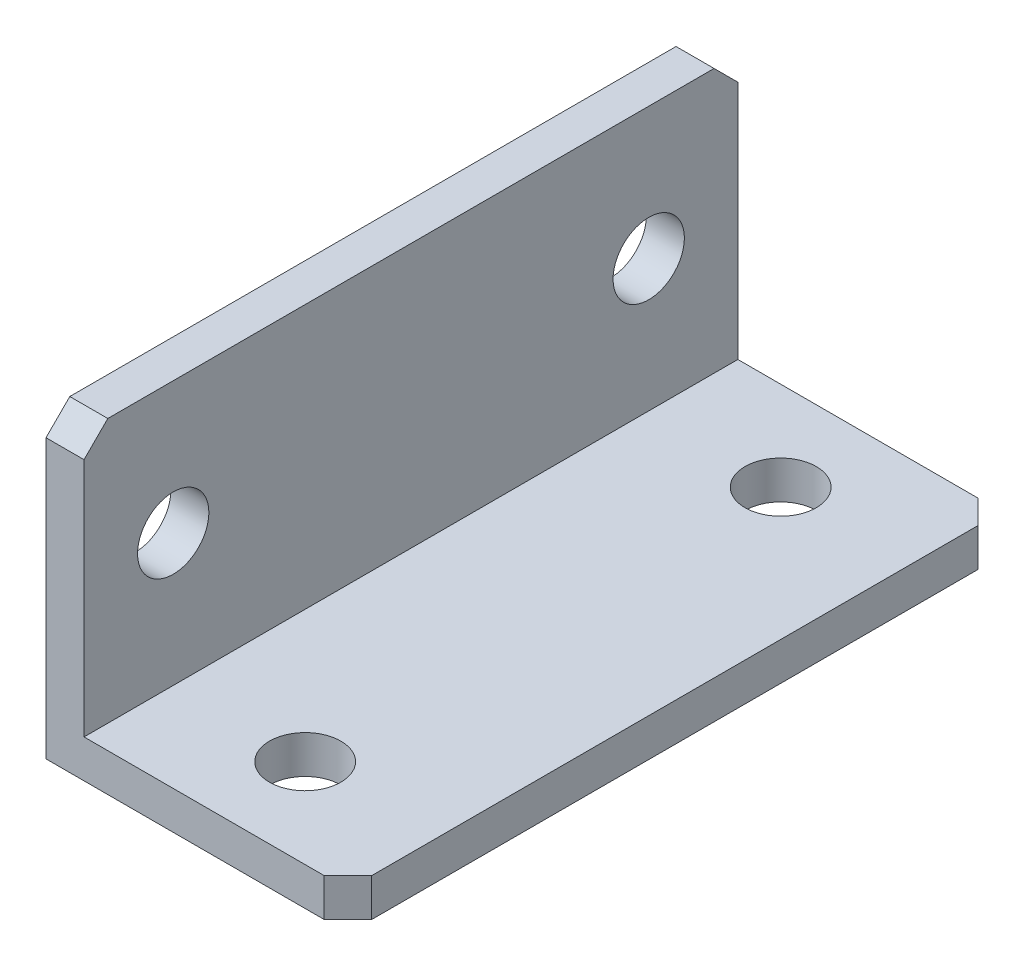
ISO-10303-21;
HEADER;
FILE_DESCRIPTION(('STEP AP214'),'2;1');
FILE_NAME('part.step','',(''),(''),'','','');
FILE_SCHEMA(('AUTOMOTIVE_DESIGN { 1 0 10303 214 1 1 1 1 }'));
ENDSEC;
DATA;
#1=APPLICATION_CONTEXT('core data for automotive mechanical design processes');
#2=APPLICATION_PROTOCOL_DEFINITION('international standard','automotive_design',2000,#1);
#3=PRODUCT_CONTEXT('',#1,'mechanical');
#4=PRODUCT('Part','Part','',(#3));
#5=PRODUCT_RELATED_PRODUCT_CATEGORY('part','',(#4));
#6=PRODUCT_DEFINITION_FORMATION('','',#4);
#7=PRODUCT_DEFINITION_CONTEXT('part definition',#1,'design');
#8=PRODUCT_DEFINITION('design','',#6,#7);
#9=PRODUCT_DEFINITION_SHAPE('','',#8);
#10=(LENGTH_UNIT() NAMED_UNIT(*) SI_UNIT(.MILLI.,.METRE.));
#11=(NAMED_UNIT(*) PLANE_ANGLE_UNIT() SI_UNIT($,.RADIAN.));
#12=(NAMED_UNIT(*) SI_UNIT($,.STERADIAN.) SOLID_ANGLE_UNIT());
#13=UNCERTAINTY_MEASURE_WITH_UNIT(LENGTH_MEASURE(1.E-05),#10,'distance_accuracy_value','');
#14=(GEOMETRIC_REPRESENTATION_CONTEXT(3) GLOBAL_UNCERTAINTY_ASSIGNED_CONTEXT((#13)) GLOBAL_UNIT_ASSIGNED_CONTEXT((#10,
#11,#12)) REPRESENTATION_CONTEXT('',''));
#15=CARTESIAN_POINT('',(0.,0.,0.));
#16=DIRECTION('',(0.,0.,1.));
#17=DIRECTION('',(1.,0.,0.));
#18=AXIS2_PLACEMENT_3D('',#15,#16,#17);
#19=CARTESIAN_POINT('',(22.2,0.,55.));
#20=DIRECTION('',(0.,-1.,0.));
#21=DIRECTION('',(1.,0.,0.));
#22=AXIS2_PLACEMENT_3D('',#19,#20,#21);
#23=PLANE('',#22);
#24=CARTESIAN_POINT('',(11.1,0.,7.5));
#25=DIRECTION('',(0.,1.,0.));
#26=DIRECTION('',(-1.,0.,0.));
#27=AXIS2_PLACEMENT_3D('',#24,#25,#26);
#28=CIRCLE('',#27,3.);
#29=CARTESIAN_POINT('',(8.1,0.,7.5));
#30=VERTEX_POINT('',#29);
#31=EDGE_CURVE('E333',#30,#30,#28,.T.);
#32=ORIENTED_EDGE('',*,*,#31,.F.);
#33=EDGE_LOOP('',(#32));
#34=FACE_BOUND('',#33,.T.);
#35=CARTESIAN_POINT('',(11.1,0.,47.5));
#36=DIRECTION('',(0.,1.,0.));
#37=DIRECTION('',(-1.,0.,0.));
#38=AXIS2_PLACEMENT_3D('',#35,#36,#37);
#39=CIRCLE('',#38,3.);
#40=CARTESIAN_POINT('',(8.1,0.,47.5));
#41=VERTEX_POINT('',#40);
#42=EDGE_CURVE('E337',#41,#41,#39,.T.);
#43=ORIENTED_EDGE('',*,*,#42,.F.);
#44=EDGE_LOOP('',(#43));
#45=FACE_BOUND('',#44,.T.);
#46=DIRECTION('',(0.,0.,-1.));
#47=VECTOR('',#46,1.);
#48=CARTESIAN_POINT('',(22.2,0.,55.));
#49=LINE('',#48,#47);
#50=CARTESIAN_POINT('',(22.2,0.,53.));
#51=VERTEX_POINT('',#50);
#52=CARTESIAN_POINT('',(22.2,0.,2.00000000000002));
#53=VERTEX_POINT('',#52);
#54=EDGE_CURVE('E214',#51,#53,#49,.T.);
#55=ORIENTED_EDGE('',*,*,#54,.T.);
#56=DIRECTION('',(-0.707106781186548,0.,-0.707106781186548));
#57=VECTOR('',#56,1.);
#58=CARTESIAN_POINT('',(22.2,0.,2.00000000000002));
#59=LINE('',#58,#57);
#60=CARTESIAN_POINT('',(20.2,0.,0.));
#61=VERTEX_POINT('',#60);
#62=EDGE_CURVE('E201',#53,#61,#59,.T.);
#63=ORIENTED_EDGE('',*,*,#62,.T.);
#64=DIRECTION('',(-1.,0.,0.));
#65=VECTOR('',#64,1.);
#66=CARTESIAN_POINT('',(22.2,0.,0.));
#67=LINE('',#66,#65);
#68=CARTESIAN_POINT('',(0.,0.,0.));
#69=VERTEX_POINT('',#68);
#70=EDGE_CURVE('E152',#61,#69,#67,.T.);
#71=ORIENTED_EDGE('',*,*,#70,.T.);
#72=DIRECTION('',(0.,0.,-1.));
#73=VECTOR('',#72,1.);
#74=CARTESIAN_POINT('',(0.,0.,55.));
#75=LINE('',#74,#73);
#76=CARTESIAN_POINT('',(0.,0.,55.));
#77=VERTEX_POINT('',#76);
#78=EDGE_CURVE('E143',#77,#69,#75,.T.);
#79=ORIENTED_EDGE('',*,*,#78,.F.);
#80=DIRECTION('',(-1.,0.,0.));
#81=VECTOR('',#80,1.);
#82=CARTESIAN_POINT('',(22.2,0.,55.));
#83=LINE('',#82,#81);
#84=CARTESIAN_POINT('',(20.2,0.,55.));
#85=VERTEX_POINT('',#84);
#86=EDGE_CURVE('E125',#85,#77,#83,.T.);
#87=ORIENTED_EDGE('',*,*,#86,.F.);
#88=DIRECTION('',(-0.707106781186548,0.,0.707106781186548));
#89=VECTOR('',#88,1.);
#90=CARTESIAN_POINT('',(20.2,0.,55.));
#91=LINE('',#90,#89);
#92=EDGE_CURVE('E198',#85,#51,#91,.F.);
#93=ORIENTED_EDGE('',*,*,#92,.T.);
#94=EDGE_LOOP('',(#55,#63,#71,#79,#87,#93));
#95=FACE_BOUND('',#94,.T.);
#96=ADVANCED_FACE('F45',(#34,#45,#95),#23,.F.);
#97=CARTESIAN_POINT('',(0.,0.,55.));
#98=DIRECTION('',(-1.,0.,0.));
#99=DIRECTION('',(0.,-1.,0.));
#100=AXIS2_PLACEMENT_3D('',#97,#98,#99);
#101=PLANE('',#100);
#102=CARTESIAN_POINT('',(0.,11.1,47.5));
#103=DIRECTION('',(1.,0.,0.));
#104=DIRECTION('',(0.,1.,0.));
#105=AXIS2_PLACEMENT_3D('',#102,#103,#104);
#106=CIRCLE('',#105,3.);
#107=CARTESIAN_POINT('',(0.,14.1,47.5));
#108=VERTEX_POINT('',#107);
#109=EDGE_CURVE('E315',#108,#108,#106,.T.);
#110=ORIENTED_EDGE('',*,*,#109,.F.);
#111=EDGE_LOOP('',(#110));
#112=FACE_BOUND('',#111,.T.);
#113=CARTESIAN_POINT('',(0.,11.1,7.5));
#114=DIRECTION('',(1.,0.,0.));
#115=DIRECTION('',(0.,1.,0.));
#116=AXIS2_PLACEMENT_3D('',#113,#114,#115);
#117=CIRCLE('',#116,3.);
#118=CARTESIAN_POINT('',(0.,14.1,7.5));
#119=VERTEX_POINT('',#118);
#120=EDGE_CURVE('E317',#119,#119,#117,.T.);
#121=ORIENTED_EDGE('',*,*,#120,.F.);
#122=EDGE_LOOP('',(#121));
#123=FACE_BOUND('',#122,.T.);
#124=DIRECTION('',(0.,1.,0.));
#125=VECTOR('',#124,1.);
#126=CARTESIAN_POINT('',(0.,0.,0.));
#127=LINE('',#126,#125);
#128=CARTESIAN_POINT('',(0.,20.2,0.));
#129=VERTEX_POINT('',#128);
#130=EDGE_CURVE('E244',#69,#129,#127,.T.);
#131=ORIENTED_EDGE('',*,*,#130,.T.);
#132=DIRECTION('',(0.,0.707106781186548,0.707106781186548));
#133=VECTOR('',#132,1.);
#134=CARTESIAN_POINT('',(0.,22.2,2.00000000000002));
#135=LINE('',#134,#133);
#136=CARTESIAN_POINT('',(0.,22.2,2.00000000000002));
#137=VERTEX_POINT('',#136);
#138=EDGE_CURVE('E184',#129,#137,#135,.T.);
#139=ORIENTED_EDGE('',*,*,#138,.T.);
#140=DIRECTION('',(0.,0.,-1.));
#141=VECTOR('',#140,1.);
#142=CARTESIAN_POINT('',(0.,22.2,55.));
#143=LINE('',#142,#141);
#144=CARTESIAN_POINT('',(0.,22.2,53.));
#145=VERTEX_POINT('',#144);
#146=EDGE_CURVE('E156',#145,#137,#143,.T.);
#147=ORIENTED_EDGE('',*,*,#146,.F.);
#148=DIRECTION('',(0.,0.707106781186548,-0.707106781186548));
#149=VECTOR('',#148,1.);
#150=CARTESIAN_POINT('',(0.,20.2,55.));
#151=LINE('',#150,#149);
#152=CARTESIAN_POINT('',(0.,20.2,55.));
#153=VERTEX_POINT('',#152);
#154=EDGE_CURVE('E146',#145,#153,#151,.F.);
#155=ORIENTED_EDGE('',*,*,#154,.T.);
#156=DIRECTION('',(0.,1.,0.));
#157=VECTOR('',#156,1.);
#158=CARTESIAN_POINT('',(0.,0.,55.));
#159=LINE('',#158,#157);
#160=EDGE_CURVE('E129',#77,#153,#159,.T.);
#161=ORIENTED_EDGE('',*,*,#160,.F.);
#162=ORIENTED_EDGE('',*,*,#78,.T.);
#163=EDGE_LOOP('',(#131,#139,#147,#155,#161,#162));
#164=FACE_BOUND('',#163,.T.);
#165=ADVANCED_FACE('F142',(#112,#123,#164),#101,.F.);
#166=CARTESIAN_POINT('',(0.,22.2,55.));
#167=DIRECTION('',(0.,-1.,0.));
#168=DIRECTION('',(0.,0.,-1.));
#169=AXIS2_PLACEMENT_3D('',#166,#167,#168);
#170=PLANE('',#169);
#171=ORIENTED_EDGE('',*,*,#146,.T.);
#172=DIRECTION('',(-1.,0.,0.));
#173=VECTOR('',#172,1.);
#174=CARTESIAN_POINT('',(-3.2,22.2,2.00000000000002));
#175=LINE('',#174,#173);
#176=CARTESIAN_POINT('',(-3.2,22.2,2.00000000000002));
#177=VERTEX_POINT('',#176);
#178=EDGE_CURVE('E160',#137,#177,#175,.T.);
#179=ORIENTED_EDGE('',*,*,#178,.T.);
#180=DIRECTION('',(0.,0.,-1.));
#181=VECTOR('',#180,1.);
#182=CARTESIAN_POINT('',(-3.2,22.2,55.));
#183=LINE('',#182,#181);
#184=CARTESIAN_POINT('',(-3.2,22.2,53.));
#185=VERTEX_POINT('',#184);
#186=EDGE_CURVE('E163',#185,#177,#183,.T.);
#187=ORIENTED_EDGE('',*,*,#186,.F.);
#188=DIRECTION('',(1.,0.,0.));
#189=VECTOR('',#188,1.);
#190=CARTESIAN_POINT('',(0.,22.2,53.));
#191=LINE('',#190,#189);
#192=EDGE_CURVE('E155',#185,#145,#191,.T.);
#193=ORIENTED_EDGE('',*,*,#192,.T.);
#194=EDGE_LOOP('',(#171,#179,#187,#193));
#195=FACE_BOUND('',#194,.T.);
#196=ADVANCED_FACE('F235',(#195),#170,.F.);
#197=CARTESIAN_POINT('',(-3.2,22.2,55.));
#198=DIRECTION('',(1.,0.,0.));
#199=DIRECTION('',(0.,1.,0.));
#200=AXIS2_PLACEMENT_3D('',#197,#198,#199);
#201=PLANE('',#200);
#202=CARTESIAN_POINT('',(-3.2,11.1,47.5));
#203=DIRECTION('',(1.,0.,0.));
#204=DIRECTION('',(0.,1.,0.));
#205=AXIS2_PLACEMENT_3D('',#202,#203,#204);
#206=CIRCLE('',#205,3.);
#207=CARTESIAN_POINT('',(-3.2,14.1,47.5));
#208=VERTEX_POINT('',#207);
#209=EDGE_CURVE('E312',#208,#208,#206,.T.);
#210=ORIENTED_EDGE('',*,*,#209,.T.);
#211=EDGE_LOOP('',(#210));
#212=FACE_BOUND('',#211,.T.);
#213=CARTESIAN_POINT('',(-3.2,11.1,7.5));
#214=DIRECTION('',(1.,0.,0.));
#215=DIRECTION('',(0.,1.,0.));
#216=AXIS2_PLACEMENT_3D('',#213,#214,#215);
#217=CIRCLE('',#216,3.);
#218=CARTESIAN_POINT('',(-3.2,14.1,7.5));
#219=VERTEX_POINT('',#218);
#220=EDGE_CURVE('E324',#219,#219,#217,.T.);
#221=ORIENTED_EDGE('',*,*,#220,.T.);
#222=EDGE_LOOP('',(#221));
#223=FACE_BOUND('',#222,.T.);
#224=ORIENTED_EDGE('',*,*,#186,.T.);
#225=DIRECTION('',(0.,-0.707106781186548,-0.707106781186548));
#226=VECTOR('',#225,1.);
#227=CARTESIAN_POINT('',(-3.2,22.2,2.00000000000002));
#228=LINE('',#227,#226);
#229=CARTESIAN_POINT('',(-3.2,20.2,0.));
#230=VERTEX_POINT('',#229);
#231=EDGE_CURVE('E173',#177,#230,#228,.T.);
#232=ORIENTED_EDGE('',*,*,#231,.T.);
#233=DIRECTION('',(0.,-1.,0.));
#234=VECTOR('',#233,1.);
#235=CARTESIAN_POINT('',(-3.2,22.2,0.));
#236=LINE('',#235,#234);
#237=CARTESIAN_POINT('',(-3.2,-3.2,0.));
#238=VERTEX_POINT('',#237);
#239=EDGE_CURVE('E247',#230,#238,#236,.T.);
#240=ORIENTED_EDGE('',*,*,#239,.T.);
#241=DIRECTION('',(0.,0.,-1.));
#242=VECTOR('',#241,1.);
#243=CARTESIAN_POINT('',(-3.2,-3.2,55.));
#244=LINE('',#243,#242);
#245=CARTESIAN_POINT('',(-3.2,-3.2,55.));
#246=VERTEX_POINT('',#245);
#247=EDGE_CURVE('E221',#246,#238,#244,.T.);
#248=ORIENTED_EDGE('',*,*,#247,.F.);
#249=DIRECTION('',(0.,-1.,0.));
#250=VECTOR('',#249,1.);
#251=CARTESIAN_POINT('',(-3.2,22.2,55.));
#252=LINE('',#251,#250);
#253=CARTESIAN_POINT('',(-3.2,20.2,55.));
#254=VERTEX_POINT('',#253);
#255=EDGE_CURVE('E148',#254,#246,#252,.T.);
#256=ORIENTED_EDGE('',*,*,#255,.F.);
#257=DIRECTION('',(0.,-0.707106781186548,0.707106781186548));
#258=VECTOR('',#257,1.);
#259=CARTESIAN_POINT('',(-3.2,20.2,55.));
#260=LINE('',#259,#258);
#261=EDGE_CURVE('E170',#254,#185,#260,.F.);
#262=ORIENTED_EDGE('',*,*,#261,.T.);
#263=EDGE_LOOP('',(#224,#232,#240,#248,#256,#262));
#264=FACE_BOUND('',#263,.T.);
#265=ADVANCED_FACE('F231',(#212,#223,#264),#201,.F.);
#266=CARTESIAN_POINT('',(-3.2,-3.2,55.));
#267=DIRECTION('',(0.,1.,0.));
#268=DIRECTION('',(-1.,0.,0.));
#269=AXIS2_PLACEMENT_3D('',#266,#267,#268);
#270=PLANE('',#269);
#271=CARTESIAN_POINT('',(11.1,-3.2,7.5));
#272=DIRECTION('',(0.,1.,0.));
#273=DIRECTION('',(-1.,0.,0.));
#274=AXIS2_PLACEMENT_3D('',#271,#272,#273);
#275=CIRCLE('',#274,3.);
#276=CARTESIAN_POINT('',(8.1,-3.2,7.5));
#277=VERTEX_POINT('',#276);
#278=EDGE_CURVE('E245',#277,#277,#275,.T.);
#279=ORIENTED_EDGE('',*,*,#278,.T.);
#280=EDGE_LOOP('',(#279));
#281=FACE_BOUND('',#280,.T.);
#282=CARTESIAN_POINT('',(11.1,-3.2,47.5));
#283=DIRECTION('',(0.,1.,0.));
#284=DIRECTION('',(-1.,0.,0.));
#285=AXIS2_PLACEMENT_3D('',#282,#283,#284);
#286=CIRCLE('',#285,3.);
#287=CARTESIAN_POINT('',(8.1,-3.2,47.5));
#288=VERTEX_POINT('',#287);
#289=EDGE_CURVE('E321',#288,#288,#286,.T.);
#290=ORIENTED_EDGE('',*,*,#289,.T.);
#291=EDGE_LOOP('',(#290));
#292=FACE_BOUND('',#291,.T.);
#293=DIRECTION('',(1.,0.,0.));
#294=VECTOR('',#293,1.);
#295=CARTESIAN_POINT('',(-3.2,-3.2,0.));
#296=LINE('',#295,#294);
#297=CARTESIAN_POINT('',(20.2,-3.2,0.));
#298=VERTEX_POINT('',#297);
#299=EDGE_CURVE('E137',#238,#298,#296,.T.);
#300=ORIENTED_EDGE('',*,*,#299,.T.);
#301=DIRECTION('',(0.707106781186548,0.,0.707106781186548));
#302=VECTOR('',#301,1.);
#303=CARTESIAN_POINT('',(22.2,-3.2,2.00000000000002));
#304=LINE('',#303,#302);
#305=CARTESIAN_POINT('',(22.2,-3.2,2.00000000000002));
#306=VERTEX_POINT('',#305);
#307=EDGE_CURVE('E11',#298,#306,#304,.T.);
#308=ORIENTED_EDGE('',*,*,#307,.T.);
#309=DIRECTION('',(0.,0.,-1.));
#310=VECTOR('',#309,1.);
#311=CARTESIAN_POINT('',(22.2,-3.2,55.));
#312=LINE('',#311,#310);
#313=CARTESIAN_POINT('',(22.2,-3.2,53.));
#314=VERTEX_POINT('',#313);
#315=EDGE_CURVE('E209',#314,#306,#312,.T.);
#316=ORIENTED_EDGE('',*,*,#315,.F.);
#317=DIRECTION('',(0.707106781186548,0.,-0.707106781186548));
#318=VECTOR('',#317,1.);
#319=CARTESIAN_POINT('',(20.2,-3.2,55.));
#320=LINE('',#319,#318);
#321=CARTESIAN_POINT('',(20.2,-3.2,55.));
#322=VERTEX_POINT('',#321);
#323=EDGE_CURVE('E55',#314,#322,#320,.F.);
#324=ORIENTED_EDGE('',*,*,#323,.T.);
#325=DIRECTION('',(1.,0.,0.));
#326=VECTOR('',#325,1.);
#327=CARTESIAN_POINT('',(-3.2,-3.2,55.));
#328=LINE('',#327,#326);
#329=EDGE_CURVE('E208',#246,#322,#328,.T.);
#330=ORIENTED_EDGE('',*,*,#329,.F.);
#331=ORIENTED_EDGE('',*,*,#247,.T.);
#332=EDGE_LOOP('',(#300,#308,#316,#324,#330,#331));
#333=FACE_BOUND('',#332,.T.);
#334=ADVANCED_FACE('F206',(#281,#292,#333),#270,.F.);
#335=CARTESIAN_POINT('',(22.2,-3.2,55.));
#336=DIRECTION('',(-1.,0.,0.));
#337=DIRECTION('',(0.,0.,1.));
#338=AXIS2_PLACEMENT_3D('',#335,#336,#337);
#339=PLANE('',#338);
#340=ORIENTED_EDGE('',*,*,#315,.T.);
#341=DIRECTION('',(0.,1.,0.));
#342=VECTOR('',#341,1.);
#343=CARTESIAN_POINT('',(22.2,0.,2.00000000000002));
#344=LINE('',#343,#342);
#345=EDGE_CURVE('E194',#306,#53,#344,.T.);
#346=ORIENTED_EDGE('',*,*,#345,.T.);
#347=ORIENTED_EDGE('',*,*,#54,.F.);
#348=DIRECTION('',(0.,-1.,0.));
#349=VECTOR('',#348,1.);
#350=CARTESIAN_POINT('',(22.2,-3.2,53.));
#351=LINE('',#350,#349);
#352=EDGE_CURVE('E67',#51,#314,#351,.T.);
#353=ORIENTED_EDGE('',*,*,#352,.T.);
#354=EDGE_LOOP('',(#340,#346,#347,#353));
#355=FACE_BOUND('',#354,.T.);
#356=ADVANCED_FACE('F216',(#355),#339,.F.);
#357=CARTESIAN_POINT('',(0.,0.,55.));
#358=DIRECTION('',(0.,0.,-1.));
#359=DIRECTION('',(-1.,0.,0.));
#360=AXIS2_PLACEMENT_3D('',#357,#358,#359);
#361=PLANE('',#360);
#362=ORIENTED_EDGE('',*,*,#160,.T.);
#363=DIRECTION('',(-1.,0.,0.));
#364=VECTOR('',#363,1.);
#365=CARTESIAN_POINT('',(0.,20.2,55.));
#366=LINE('',#365,#364);
#367=EDGE_CURVE('E189',#153,#254,#366,.T.);
#368=ORIENTED_EDGE('',*,*,#367,.T.);
#369=ORIENTED_EDGE('',*,*,#255,.T.);
#370=ORIENTED_EDGE('',*,*,#329,.T.);
#371=DIRECTION('',(0.,1.,0.));
#372=VECTOR('',#371,1.);
#373=CARTESIAN_POINT('',(20.2,0.,55.));
#374=LINE('',#373,#372);
#375=EDGE_CURVE('E133',#322,#85,#374,.T.);
#376=ORIENTED_EDGE('',*,*,#375,.T.);
#377=ORIENTED_EDGE('',*,*,#86,.T.);
#378=EDGE_LOOP('',(#362,#368,#369,#370,#376,#377));
#379=FACE_BOUND('',#378,.T.);
#380=ADVANCED_FACE('F127',(#379),#361,.F.);
#381=CARTESIAN_POINT('',(0.,0.,0.));
#382=DIRECTION('',(0.,0.,-1.));
#383=DIRECTION('',(-1.,0.,0.));
#384=AXIS2_PLACEMENT_3D('',#381,#382,#383);
#385=PLANE('',#384);
#386=ORIENTED_EDGE('',*,*,#239,.F.);
#387=DIRECTION('',(1.,0.,0.));
#388=VECTOR('',#387,1.);
#389=CARTESIAN_POINT('',(0.,20.2,0.));
#390=LINE('',#389,#388);
#391=EDGE_CURVE('E179',#230,#129,#390,.T.);
#392=ORIENTED_EDGE('',*,*,#391,.T.);
#393=ORIENTED_EDGE('',*,*,#130,.F.);
#394=ORIENTED_EDGE('',*,*,#70,.F.);
#395=DIRECTION('',(0.,-1.,0.));
#396=VECTOR('',#395,1.);
#397=CARTESIAN_POINT('',(20.2,-3.2,0.));
#398=LINE('',#397,#396);
#399=EDGE_CURVE('E176',#61,#298,#398,.T.);
#400=ORIENTED_EDGE('',*,*,#399,.T.);
#401=ORIENTED_EDGE('',*,*,#299,.F.);
#402=EDGE_LOOP('',(#386,#392,#393,#394,#400,#401));
#403=FACE_BOUND('',#402,.T.);
#404=ADVANCED_FACE('F255',(#403),#385,.T.);
#405=CARTESIAN_POINT('',(0.,22.2,2.00000000000002));
#406=DIRECTION('',(0.,0.707106781186547,-0.707106781186547));
#407=DIRECTION('',(1.,0.,0.));
#408=AXIS2_PLACEMENT_3D('',#405,#406,#407);
#409=PLANE('',#408);
#410=ORIENTED_EDGE('',*,*,#138,.F.);
#411=ORIENTED_EDGE('',*,*,#391,.F.);
#412=ORIENTED_EDGE('',*,*,#231,.F.);
#413=ORIENTED_EDGE('',*,*,#178,.F.);
#414=EDGE_LOOP('',(#410,#411,#412,#413));
#415=FACE_BOUND('',#414,.T.);
#416=ADVANCED_FACE('F259',(#415),#409,.T.);
#417=CARTESIAN_POINT('',(0.,20.2,55.));
#418=DIRECTION('',(0.,-0.707106781186547,-0.707106781186547));
#419=DIRECTION('',(-1.,0.,0.));
#420=AXIS2_PLACEMENT_3D('',#417,#418,#419);
#421=PLANE('',#420);
#422=ORIENTED_EDGE('',*,*,#154,.F.);
#423=ORIENTED_EDGE('',*,*,#192,.F.);
#424=ORIENTED_EDGE('',*,*,#261,.F.);
#425=ORIENTED_EDGE('',*,*,#367,.F.);
#426=EDGE_LOOP('',(#422,#423,#424,#425));
#427=FACE_BOUND('',#426,.T.);
#428=ADVANCED_FACE('F238',(#427),#421,.F.);
#429=CARTESIAN_POINT('',(22.2,-3.2,2.00000000000002));
#430=DIRECTION('',(0.707106781186547,0.,-0.707106781186547));
#431=DIRECTION('',(0.,-1.,0.));
#432=AXIS2_PLACEMENT_3D('',#429,#430,#431);
#433=PLANE('',#432);
#434=ORIENTED_EDGE('',*,*,#307,.F.);
#435=ORIENTED_EDGE('',*,*,#399,.F.);
#436=ORIENTED_EDGE('',*,*,#62,.F.);
#437=ORIENTED_EDGE('',*,*,#345,.F.);
#438=EDGE_LOOP('',(#434,#435,#436,#437));
#439=FACE_BOUND('',#438,.T.);
#440=ADVANCED_FACE('F254',(#439),#433,.T.);
#441=CARTESIAN_POINT('',(20.2,0.,55.));
#442=DIRECTION('',(-0.707106781186547,0.,-0.707106781186547));
#443=DIRECTION('',(0.,1.,0.));
#444=AXIS2_PLACEMENT_3D('',#441,#442,#443);
#445=PLANE('',#444);
#446=ORIENTED_EDGE('',*,*,#323,.F.);
#447=ORIENTED_EDGE('',*,*,#352,.F.);
#448=ORIENTED_EDGE('',*,*,#92,.F.);
#449=ORIENTED_EDGE('',*,*,#375,.F.);
#450=EDGE_LOOP('',(#446,#447,#448,#449));
#451=FACE_BOUND('',#450,.T.);
#452=ADVANCED_FACE('F48',(#451),#445,.F.);
#453=CARTESIAN_POINT('',(11.1,-3.2,47.5));
#454=DIRECTION('',(0.,1.,0.));
#455=DIRECTION('',(-1.,0.,0.));
#456=AXIS2_PLACEMENT_3D('',#453,#454,#455);
#457=CYLINDRICAL_SURFACE('',#456,3.);
#458=ORIENTED_EDGE('',*,*,#289,.F.);
#459=EDGE_LOOP('',(#458));
#460=FACE_BOUND('',#459,.T.);
#461=ORIENTED_EDGE('',*,*,#42,.T.);
#462=EDGE_LOOP('',(#461));
#463=FACE_BOUND('',#462,.T.);
#464=ADVANCED_FACE('F292',(#460,#463),#457,.F.);
#465=CARTESIAN_POINT('',(11.1,-3.2,7.5));
#466=DIRECTION('',(0.,1.,0.));
#467=DIRECTION('',(-1.,0.,0.));
#468=AXIS2_PLACEMENT_3D('',#465,#466,#467);
#469=CYLINDRICAL_SURFACE('',#468,3.);
#470=ORIENTED_EDGE('',*,*,#278,.F.);
#471=EDGE_LOOP('',(#470));
#472=FACE_BOUND('',#471,.T.);
#473=ORIENTED_EDGE('',*,*,#31,.T.);
#474=EDGE_LOOP('',(#473));
#475=FACE_BOUND('',#474,.T.);
#476=ADVANCED_FACE('F295',(#472,#475),#469,.F.);
#477=CARTESIAN_POINT('',(-3.2,11.1,7.5));
#478=DIRECTION('',(1.,0.,0.));
#479=DIRECTION('',(0.,1.,0.));
#480=AXIS2_PLACEMENT_3D('',#477,#478,#479);
#481=CYLINDRICAL_SURFACE('',#480,3.);
#482=ORIENTED_EDGE('',*,*,#220,.F.);
#483=EDGE_LOOP('',(#482));
#484=FACE_BOUND('',#483,.T.);
#485=ORIENTED_EDGE('',*,*,#120,.T.);
#486=EDGE_LOOP('',(#485));
#487=FACE_BOUND('',#486,.T.);
#488=ADVANCED_FACE('F299',(#484,#487),#481,.F.);
#489=CARTESIAN_POINT('',(-3.2,11.1,47.5));
#490=DIRECTION('',(1.,0.,0.));
#491=DIRECTION('',(0.,1.,0.));
#492=AXIS2_PLACEMENT_3D('',#489,#490,#491);
#493=CYLINDRICAL_SURFACE('',#492,3.);
#494=ORIENTED_EDGE('',*,*,#209,.F.);
#495=EDGE_LOOP('',(#494));
#496=FACE_BOUND('',#495,.T.);
#497=ORIENTED_EDGE('',*,*,#109,.T.);
#498=EDGE_LOOP('',(#497));
#499=FACE_BOUND('',#498,.T.);
#500=ADVANCED_FACE('F303',(#496,#499),#493,.F.);
#501=CLOSED_SHELL('',(#96,#165,#196,#265,#334,#356,#380,#404,#416,#428,#440,#452,#464,#476,#488,#500));
#502=MANIFOLD_SOLID_BREP('B2',#501);
#503=ADVANCED_BREP_SHAPE_REPRESENTATION('',(#18,#502),#14);
#504=SHAPE_DEFINITION_REPRESENTATION(#9,#503);
ENDSEC;
END-ISO-10303-21;
